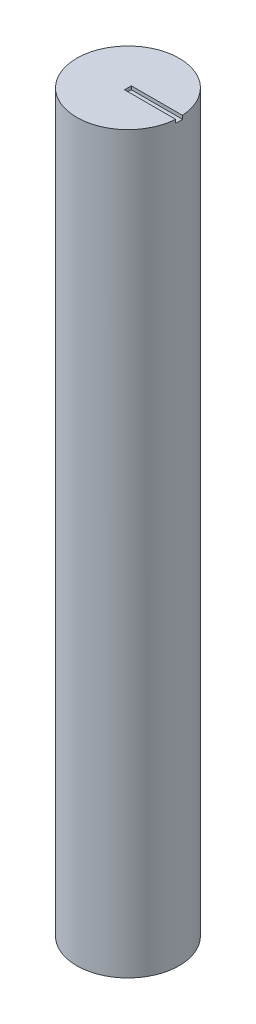
ISO-10303-21;
HEADER;
FILE_DESCRIPTION(('STEP AP214'),'2;1');
FILE_NAME('part.step','',(''),(''),'','','');
FILE_SCHEMA(('AUTOMOTIVE_DESIGN { 1 0 10303 214 1 1 1 1 }'));
ENDSEC;
DATA;
#1=APPLICATION_CONTEXT('core data for automotive mechanical design processes');
#2=APPLICATION_PROTOCOL_DEFINITION('international standard','automotive_design',2000,#1);
#3=PRODUCT_CONTEXT('',#1,'mechanical');
#4=PRODUCT('Part','Part','',(#3));
#5=PRODUCT_RELATED_PRODUCT_CATEGORY('part','',(#4));
#6=PRODUCT_DEFINITION_FORMATION('','',#4);
#7=PRODUCT_DEFINITION_CONTEXT('part definition',#1,'design');
#8=PRODUCT_DEFINITION('design','',#6,#7);
#9=PRODUCT_DEFINITION_SHAPE('','',#8);
#10=(LENGTH_UNIT() NAMED_UNIT(*) SI_UNIT(.MILLI.,.METRE.));
#11=(NAMED_UNIT(*) PLANE_ANGLE_UNIT() SI_UNIT($,.RADIAN.));
#12=(NAMED_UNIT(*) SI_UNIT($,.STERADIAN.) SOLID_ANGLE_UNIT());
#13=UNCERTAINTY_MEASURE_WITH_UNIT(LENGTH_MEASURE(1.E-05),#10,'distance_accuracy_value','');
#14=(GEOMETRIC_REPRESENTATION_CONTEXT(3) GLOBAL_UNCERTAINTY_ASSIGNED_CONTEXT((#13)) GLOBAL_UNIT_ASSIGNED_CONTEXT((#10,
#11,#12)) REPRESENTATION_CONTEXT('',''));
#15=CARTESIAN_POINT('',(0.,0.,0.));
#16=DIRECTION('',(0.,0.,1.));
#17=DIRECTION('',(1.,0.,0.));
#18=AXIS2_PLACEMENT_3D('',#15,#16,#17);
#19=CARTESIAN_POINT('',(0.,21.5,0.));
#20=DIRECTION('',(0.,-1.,0.));
#21=DIRECTION('',(0.,0.,-1.));
#22=AXIS2_PLACEMENT_3D('',#19,#20,#21);
#23=CYLINDRICAL_SURFACE('',#22,1.5);
#24=CARTESIAN_POINT('',(0.,0.,0.));
#25=DIRECTION('',(0.,1.,0.));
#26=DIRECTION('',(0.,0.,1.));
#27=AXIS2_PLACEMENT_3D('',#24,#25,#26);
#28=CIRCLE('',#27,1.5);
#29=CARTESIAN_POINT('',(0.,0.,1.5));
#30=VERTEX_POINT('',#29);
#31=EDGE_CURVE('E128',#30,#30,#28,.T.);
#32=ORIENTED_EDGE('',*,*,#31,.T.);
#33=EDGE_LOOP('',(#32));
#34=FACE_BOUND('',#33,.T.);
#35=DIRECTION('',(0.,-1.,0.));
#36=VECTOR('',#35,1.);
#37=CARTESIAN_POINT('',(1.49665208374926,21.5,0.100162568901819));
#38=LINE('',#37,#36);
#39=CARTESIAN_POINT('',(1.49665208374926,21.5,0.100162568901819));
#40=VERTEX_POINT('',#39);
#41=CARTESIAN_POINT('',(1.49666014615279,21.4,0.100084000673188));
#42=VERTEX_POINT('',#41);
#43=EDGE_CURVE('E110',#40,#42,#38,.T.);
#44=ORIENTED_EDGE('',*,*,#43,.F.);
#45=CARTESIAN_POINT('',(0.,21.5,0.));
#46=DIRECTION('',(0.,1.,0.));
#47=DIRECTION('',(0.,0.,1.));
#48=AXIS2_PLACEMENT_3D('',#45,#46,#47);
#49=CIRCLE('',#48,1.5);
#50=CARTESIAN_POINT('',(1.49666295470958,21.5,-0.1));
#51=VERTEX_POINT('',#50);
#52=EDGE_CURVE('E115',#51,#40,#49,.T.);
#53=ORIENTED_EDGE('',*,*,#52,.F.);
#54=DIRECTION('',(0.,-1.,0.));
#55=VECTOR('',#54,1.);
#56=CARTESIAN_POINT('',(1.49666295470958,21.5,-0.1));
#57=LINE('',#56,#55);
#58=CARTESIAN_POINT('',(1.49666295470958,21.4,-0.1));
#59=VERTEX_POINT('',#58);
#60=EDGE_CURVE('E131',#59,#51,#57,.F.);
#61=ORIENTED_EDGE('',*,*,#60,.F.);
#62=CARTESIAN_POINT('',(0.,21.4,0.));
#63=DIRECTION('',(0.,-1.,0.));
#64=DIRECTION('',(0.997775303139718,0.,-0.0666666666666667));
#65=AXIS2_PLACEMENT_3D('',#62,#63,#64);
#66=CIRCLE('',#65,1.5);
#67=EDGE_CURVE('E152',#59,#42,#66,.T.);
#68=ORIENTED_EDGE('',*,*,#67,.T.);
#69=EDGE_LOOP('',(#44,#53,#61,#68));
#70=FACE_BOUND('',#69,.T.);
#71=ADVANCED_FACE('F43',(#34,#70),#23,.T.);
#72=CARTESIAN_POINT('',(0.,21.5,0.));
#73=DIRECTION('',(0.,1.,0.));
#74=DIRECTION('',(0.,0.,1.));
#75=AXIS2_PLACEMENT_3D('',#72,#73,#74);
#76=PLANE('',#75);
#77=DIRECTION('',(1.,0.,0.));
#78=VECTOR('',#77,1.);
#79=CARTESIAN_POINT('',(1.47043039982424,21.5,0.100162568901819));
#80=LINE('',#79,#78);
#81=CARTESIAN_POINT('',(1.47043039982424,21.5,0.100162568901819));
#82=VERTEX_POINT('',#81);
#83=EDGE_CURVE('E101',#82,#40,#80,.T.);
#84=ORIENTED_EDGE('',*,*,#83,.F.);
#85=DIRECTION('',(0.,0.,1.));
#86=VECTOR('',#85,1.);
#87=CARTESIAN_POINT('',(1.47043039982424,21.5,-0.1));
#88=LINE('',#87,#86);
#89=CARTESIAN_POINT('',(1.47043039982424,21.5,0.1));
#90=VERTEX_POINT('',#89);
#91=EDGE_CURVE('E92',#90,#82,#88,.T.);
#92=ORIENTED_EDGE('',*,*,#91,.F.);
#93=DIRECTION('',(1.,0.,0.));
#94=VECTOR('',#93,1.);
#95=CARTESIAN_POINT('',(0.,21.5,0.1));
#96=LINE('',#95,#94);
#97=CARTESIAN_POINT('',(0.,21.5,0.1));
#98=VERTEX_POINT('',#97);
#99=EDGE_CURVE('E207',#98,#90,#96,.T.);
#100=ORIENTED_EDGE('',*,*,#99,.F.);
#101=DIRECTION('',(0.,0.,1.));
#102=VECTOR('',#101,1.);
#103=CARTESIAN_POINT('',(0.,21.5,0.));
#104=LINE('',#103,#102);
#105=CARTESIAN_POINT('',(0.,21.5,-0.1));
#106=VERTEX_POINT('',#105);
#107=EDGE_CURVE('E162',#106,#98,#104,.T.);
#108=ORIENTED_EDGE('',*,*,#107,.F.);
#109=DIRECTION('',(1.,0.,0.));
#110=VECTOR('',#109,1.);
#111=CARTESIAN_POINT('',(0.,21.5,-0.1));
#112=LINE('',#111,#110);
#113=EDGE_CURVE('E197',#106,#51,#112,.T.);
#114=ORIENTED_EDGE('',*,*,#113,.T.);
#115=ORIENTED_EDGE('',*,*,#52,.T.);
#116=EDGE_LOOP('',(#84,#92,#100,#108,#114,#115));
#117=FACE_BOUND('',#116,.T.);
#118=ADVANCED_FACE('F113',(#117),#76,.T.);
#119=CARTESIAN_POINT('',(0.,21.4,0.1));
#120=DIRECTION('',(0.,0.,1.));
#121=DIRECTION('',(1.,0.,0.));
#122=AXIS2_PLACEMENT_3D('',#119,#120,#121);
#123=PLANE('',#122);
#124=DIRECTION('',(0.,1.,0.));
#125=VECTOR('',#124,1.);
#126=CARTESIAN_POINT('',(1.47043039982424,21.4,0.1));
#127=LINE('',#126,#125);
#128=CARTESIAN_POINT('',(1.47043039982424,21.4,0.1));
#129=VERTEX_POINT('',#128);
#130=EDGE_CURVE('E11',#129,#90,#127,.T.);
#131=ORIENTED_EDGE('',*,*,#130,.F.);
#132=DIRECTION('',(1.,0.,0.));
#133=VECTOR('',#132,1.);
#134=CARTESIAN_POINT('',(0.,21.4,0.1));
#135=LINE('',#134,#133);
#136=CARTESIAN_POINT('',(0.,21.4,0.1));
#137=VERTEX_POINT('',#136);
#138=EDGE_CURVE('E158',#137,#129,#135,.T.);
#139=ORIENTED_EDGE('',*,*,#138,.F.);
#140=DIRECTION('',(0.,1.,0.));
#141=VECTOR('',#140,1.);
#142=CARTESIAN_POINT('',(0.,21.4,0.1));
#143=LINE('',#142,#141);
#144=EDGE_CURVE('E53',#137,#98,#143,.T.);
#145=ORIENTED_EDGE('',*,*,#144,.T.);
#146=ORIENTED_EDGE('',*,*,#99,.T.);
#147=EDGE_LOOP('',(#131,#139,#145,#146));
#148=FACE_BOUND('',#147,.T.);
#149=ADVANCED_FACE('F184',(#148),#123,.F.);
#150=CARTESIAN_POINT('',(0.,0.,0.));
#151=DIRECTION('',(0.,1.,0.));
#152=DIRECTION('',(0.,0.,1.));
#153=AXIS2_PLACEMENT_3D('',#150,#151,#152);
#154=PLANE('',#153);
#155=ORIENTED_EDGE('',*,*,#31,.F.);
#156=EDGE_LOOP('',(#155));
#157=FACE_BOUND('',#156,.T.);
#158=ADVANCED_FACE('F191',(#157),#154,.F.);
#159=CARTESIAN_POINT('',(0.,21.4,-0.1));
#160=DIRECTION('',(0.,0.,1.));
#161=DIRECTION('',(1.,0.,0.));
#162=AXIS2_PLACEMENT_3D('',#159,#160,#161);
#163=PLANE('',#162);
#164=ORIENTED_EDGE('',*,*,#60,.T.);
#165=ORIENTED_EDGE('',*,*,#113,.F.);
#166=DIRECTION('',(0.,1.,0.));
#167=VECTOR('',#166,1.);
#168=CARTESIAN_POINT('',(0.,21.4,-0.1));
#169=LINE('',#168,#167);
#170=CARTESIAN_POINT('',(0.,21.4,-0.1));
#171=VERTEX_POINT('',#170);
#172=EDGE_CURVE('E206',#171,#106,#169,.T.);
#173=ORIENTED_EDGE('',*,*,#172,.F.);
#174=DIRECTION('',(1.,0.,0.));
#175=VECTOR('',#174,1.);
#176=CARTESIAN_POINT('',(0.,21.4,-0.1));
#177=LINE('',#176,#175);
#178=EDGE_CURVE('E136',#171,#59,#177,.T.);
#179=ORIENTED_EDGE('',*,*,#178,.T.);
#180=EDGE_LOOP('',(#164,#165,#173,#179));
#181=FACE_BOUND('',#180,.T.);
#182=ADVANCED_FACE('F182',(#181),#163,.T.);
#183=CARTESIAN_POINT('',(0.,21.4,0.));
#184=DIRECTION('',(0.,1.,0.));
#185=DIRECTION('',(0.,0.,1.));
#186=AXIS2_PLACEMENT_3D('',#183,#184,#185);
#187=PLANE('',#186);
#188=ORIENTED_EDGE('',*,*,#67,.F.);
#189=ORIENTED_EDGE('',*,*,#178,.F.);
#190=DIRECTION('',(0.,0.,1.));
#191=VECTOR('',#190,1.);
#192=CARTESIAN_POINT('',(0.,21.4,0.));
#193=LINE('',#192,#191);
#194=EDGE_CURVE('E135',#171,#137,#193,.T.);
#195=ORIENTED_EDGE('',*,*,#194,.T.);
#196=ORIENTED_EDGE('',*,*,#138,.T.);
#197=DIRECTION('',(0.,0.,1.));
#198=VECTOR('',#197,1.);
#199=CARTESIAN_POINT('',(1.47043039982424,21.4,-0.1));
#200=LINE('',#199,#198);
#201=CARTESIAN_POINT('',(1.47043039982424,21.4,0.100162568901819));
#202=VERTEX_POINT('',#201);
#203=EDGE_CURVE('E119',#129,#202,#200,.T.);
#204=ORIENTED_EDGE('',*,*,#203,.T.);
#205=DIRECTION('',(1.,0.,0.));
#206=VECTOR('',#205,1.);
#207=CARTESIAN_POINT('',(1.47043039982424,21.4,0.100162568901819));
#208=LINE('',#207,#206);
#209=EDGE_CURVE('E102',#202,#42,#208,.T.);
#210=ORIENTED_EDGE('',*,*,#209,.T.);
#211=EDGE_LOOP('',(#188,#189,#195,#196,#204,#210));
#212=FACE_BOUND('',#211,.T.);
#213=ADVANCED_FACE('F172',(#212),#187,.T.);
#214=CARTESIAN_POINT('',(0.,21.4,0.));
#215=DIRECTION('',(-1.,0.,0.));
#216=DIRECTION('',(0.,0.,1.));
#217=AXIS2_PLACEMENT_3D('',#214,#215,#216);
#218=PLANE('',#217);
#219=ORIENTED_EDGE('',*,*,#107,.T.);
#220=ORIENTED_EDGE('',*,*,#144,.F.);
#221=ORIENTED_EDGE('',*,*,#194,.F.);
#222=ORIENTED_EDGE('',*,*,#172,.T.);
#223=EDGE_LOOP('',(#219,#220,#221,#222));
#224=FACE_BOUND('',#223,.T.);
#225=ADVANCED_FACE('F181',(#224),#218,.F.);
#226=CARTESIAN_POINT('',(1.47043039982424,21.5,0.100162568901819));
#227=DIRECTION('',(0.,0.,-1.));
#228=DIRECTION('',(-1.,0.,0.));
#229=AXIS2_PLACEMENT_3D('',#226,#227,#228);
#230=PLANE('',#229);
#231=ORIENTED_EDGE('',*,*,#43,.T.);
#232=ORIENTED_EDGE('',*,*,#209,.F.);
#233=DIRECTION('',(0.,-1.,0.));
#234=VECTOR('',#233,1.);
#235=CARTESIAN_POINT('',(1.47043039982424,21.5,0.100162568901819));
#236=LINE('',#235,#234);
#237=EDGE_CURVE('E95',#82,#202,#236,.T.);
#238=ORIENTED_EDGE('',*,*,#237,.F.);
#239=ORIENTED_EDGE('',*,*,#83,.T.);
#240=EDGE_LOOP('',(#231,#232,#238,#239));
#241=FACE_BOUND('',#240,.T.);
#242=ADVANCED_FACE('F107',(#241),#230,.T.);
#243=CARTESIAN_POINT('',(1.47043039982424,21.5,-0.1));
#244=DIRECTION('',(1.,0.,0.));
#245=DIRECTION('',(0.,0.,-1.));
#246=AXIS2_PLACEMENT_3D('',#243,#244,#245);
#247=PLANE('',#246);
#248=ORIENTED_EDGE('',*,*,#130,.T.);
#249=ORIENTED_EDGE('',*,*,#91,.T.);
#250=ORIENTED_EDGE('',*,*,#237,.T.);
#251=ORIENTED_EDGE('',*,*,#203,.F.);
#252=EDGE_LOOP('',(#248,#249,#250,#251));
#253=FACE_BOUND('',#252,.T.);
#254=ADVANCED_FACE('F94',(#253),#247,.T.);
#255=CLOSED_SHELL('',(#71,#118,#149,#158,#182,#213,#225,#242,#254));
#256=MANIFOLD_SOLID_BREP('B2',#255);
#257=ADVANCED_BREP_SHAPE_REPRESENTATION('',(#18,#256),#14);
#258=SHAPE_DEFINITION_REPRESENTATION(#9,#257);
ENDSEC;
END-ISO-10303-21;
